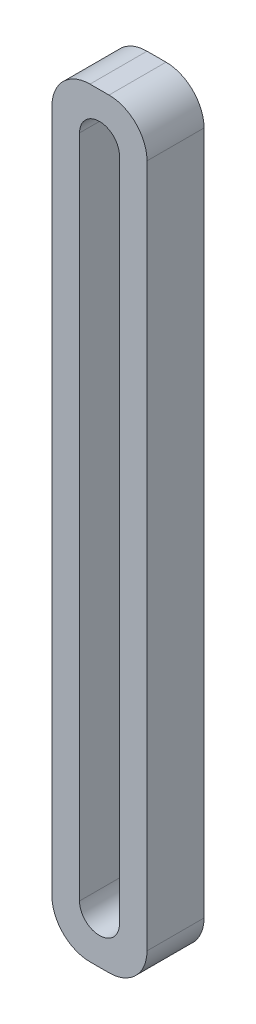
ISO-10303-21;
HEADER;
FILE_DESCRIPTION(('STEP AP214'),'2;1');
FILE_NAME('part.step','',(''),(''),'','','');
FILE_SCHEMA(('AUTOMOTIVE_DESIGN { 1 0 10303 214 1 1 1 1 }'));
ENDSEC;
DATA;
#1=APPLICATION_CONTEXT('core data for automotive mechanical design processes');
#2=APPLICATION_PROTOCOL_DEFINITION('international standard','automotive_design',2000,#1);
#3=PRODUCT_CONTEXT('',#1,'mechanical');
#4=PRODUCT('Part','Part','',(#3));
#5=PRODUCT_RELATED_PRODUCT_CATEGORY('part','',(#4));
#6=PRODUCT_DEFINITION_FORMATION('','',#4);
#7=PRODUCT_DEFINITION_CONTEXT('part definition',#1,'design');
#8=PRODUCT_DEFINITION('design','',#6,#7);
#9=PRODUCT_DEFINITION_SHAPE('','',#8);
#10=(LENGTH_UNIT() NAMED_UNIT(*) SI_UNIT(.MILLI.,.METRE.));
#11=(NAMED_UNIT(*) PLANE_ANGLE_UNIT() SI_UNIT($,.RADIAN.));
#12=(NAMED_UNIT(*) SI_UNIT($,.STERADIAN.) SOLID_ANGLE_UNIT());
#13=UNCERTAINTY_MEASURE_WITH_UNIT(LENGTH_MEASURE(1.E-05),#10,'distance_accuracy_value','');
#14=(GEOMETRIC_REPRESENTATION_CONTEXT(3) GLOBAL_UNCERTAINTY_ASSIGNED_CONTEXT((#13)) GLOBAL_UNIT_ASSIGNED_CONTEXT((#10,
#11,#12)) REPRESENTATION_CONTEXT('',''));
#15=CARTESIAN_POINT('',(0.,0.,0.));
#16=DIRECTION('',(0.,0.,1.));
#17=DIRECTION('',(1.,0.,0.));
#18=AXIS2_PLACEMENT_3D('',#15,#16,#17);
#19=CARTESIAN_POINT('',(0.,0.,3.));
#20=DIRECTION('',(0.,0.,-1.));
#21=DIRECTION('',(-1.,0.,0.));
#22=AXIS2_PLACEMENT_3D('',#19,#20,#21);
#23=PLANE('',#22);
#24=DIRECTION('',(1.,0.,0.));
#25=VECTOR('',#24,1.);
#26=CARTESIAN_POINT('',(0.,0.,3.));
#27=LINE('',#26,#25);
#28=CARTESIAN_POINT('',(2.,0.,3.));
#29=VERTEX_POINT('',#28);
#30=CARTESIAN_POINT('',(3.,0.,3.));
#31=VERTEX_POINT('',#30);
#32=EDGE_CURVE('E167',#29,#31,#27,.T.);
#33=ORIENTED_EDGE('',*,*,#32,.T.);
#34=CARTESIAN_POINT('',(3.,2.,3.));
#35=DIRECTION('',(0.,0.,-1.));
#36=DIRECTION('',(-1.,0.,0.));
#37=AXIS2_PLACEMENT_3D('',#34,#35,#36);
#38=CIRCLE('',#37,2.);
#39=CARTESIAN_POINT('',(5.,2.,3.));
#40=VERTEX_POINT('',#39);
#41=EDGE_CURVE('E207',#31,#40,#38,.F.);
#42=ORIENTED_EDGE('',*,*,#41,.T.);
#43=DIRECTION('',(0.,1.,0.));
#44=VECTOR('',#43,1.);
#45=CARTESIAN_POINT('',(5.,0.,3.));
#46=LINE('',#45,#44);
#47=CARTESIAN_POINT('',(5.,38.,3.));
#48=VERTEX_POINT('',#47);
#49=EDGE_CURVE('E171',#40,#48,#46,.T.);
#50=ORIENTED_EDGE('',*,*,#49,.T.);
#51=CARTESIAN_POINT('',(3.,38.,3.));
#52=DIRECTION('',(0.,0.,-1.));
#53=DIRECTION('',(-1.,0.,0.));
#54=AXIS2_PLACEMENT_3D('',#51,#52,#53);
#55=CIRCLE('',#54,2.);
#56=CARTESIAN_POINT('',(3.,40.,3.));
#57=VERTEX_POINT('',#56);
#58=EDGE_CURVE('E53',#48,#57,#55,.F.);
#59=ORIENTED_EDGE('',*,*,#58,.T.);
#60=DIRECTION('',(-1.,0.,0.));
#61=VECTOR('',#60,1.);
#62=CARTESIAN_POINT('',(0.,40.,3.));
#63=LINE('',#62,#61);
#64=CARTESIAN_POINT('',(2.,40.,3.));
#65=VERTEX_POINT('',#64);
#66=EDGE_CURVE('E173',#57,#65,#63,.T.);
#67=ORIENTED_EDGE('',*,*,#66,.T.);
#68=CARTESIAN_POINT('',(2.,38.,3.));
#69=DIRECTION('',(0.,0.,-1.));
#70=DIRECTION('',(-1.,0.,0.));
#71=AXIS2_PLACEMENT_3D('',#68,#69,#70);
#72=CIRCLE('',#71,2.);
#73=CARTESIAN_POINT('',(0.,38.,3.));
#74=VERTEX_POINT('',#73);
#75=EDGE_CURVE('E203',#65,#74,#72,.F.);
#76=ORIENTED_EDGE('',*,*,#75,.T.);
#77=DIRECTION('',(0.,-1.,0.));
#78=VECTOR('',#77,1.);
#79=CARTESIAN_POINT('',(0.,0.,3.));
#80=LINE('',#79,#78);
#81=CARTESIAN_POINT('',(0.,2.,3.));
#82=VERTEX_POINT('',#81);
#83=EDGE_CURVE('E164',#74,#82,#80,.T.);
#84=ORIENTED_EDGE('',*,*,#83,.T.);
#85=CARTESIAN_POINT('',(2.,2.,3.));
#86=DIRECTION('',(0.,0.,-1.));
#87=DIRECTION('',(-1.,0.,0.));
#88=AXIS2_PLACEMENT_3D('',#85,#86,#87);
#89=CIRCLE('',#88,2.);
#90=EDGE_CURVE('E205',#82,#29,#89,.F.);
#91=ORIENTED_EDGE('',*,*,#90,.T.);
#92=EDGE_LOOP('',(#33,#42,#50,#59,#67,#76,#84,#91));
#93=FACE_BOUND('',#92,.T.);
#94=CARTESIAN_POINT('',(2.5,37.5,3.));
#95=DIRECTION('',(0.,0.,1.));
#96=DIRECTION('',(1.,0.,0.));
#97=AXIS2_PLACEMENT_3D('',#94,#95,#96);
#98=CIRCLE('',#97,1.05);
#99=CARTESIAN_POINT('',(3.55,37.5,3.));
#100=VERTEX_POINT('',#99);
#101=CARTESIAN_POINT('',(1.45,37.5,3.));
#102=VERTEX_POINT('',#101);
#103=EDGE_CURVE('E123',#100,#102,#98,.T.);
#104=ORIENTED_EDGE('',*,*,#103,.F.);
#105=DIRECTION('',(0.,1.,0.));
#106=VECTOR('',#105,1.);
#107=CARTESIAN_POINT('',(3.55,37.5,3.));
#108=LINE('',#107,#106);
#109=CARTESIAN_POINT('',(3.55,2.5,3.));
#110=VERTEX_POINT('',#109);
#111=EDGE_CURVE('E148',#110,#100,#108,.T.);
#112=ORIENTED_EDGE('',*,*,#111,.F.);
#113=CARTESIAN_POINT('',(2.5,2.5,3.));
#114=DIRECTION('',(0.,0.,1.));
#115=DIRECTION('',(1.,0.,0.));
#116=AXIS2_PLACEMENT_3D('',#113,#114,#115);
#117=CIRCLE('',#116,1.05);
#118=CARTESIAN_POINT('',(1.45,2.5,3.));
#119=VERTEX_POINT('',#118);
#120=EDGE_CURVE('E146',#119,#110,#117,.T.);
#121=ORIENTED_EDGE('',*,*,#120,.F.);
#122=DIRECTION('',(0.,-1.,0.));
#123=VECTOR('',#122,1.);
#124=CARTESIAN_POINT('',(1.45,37.5,3.));
#125=LINE('',#124,#123);
#126=EDGE_CURVE('E133',#102,#119,#125,.T.);
#127=ORIENTED_EDGE('',*,*,#126,.F.);
#128=EDGE_LOOP('',(#104,#112,#121,#127));
#129=FACE_BOUND('',#128,.T.);
#130=ADVANCED_FACE('F33',(#93,#129),#23,.F.);
#131=CARTESIAN_POINT('',(0.,0.,0.));
#132=DIRECTION('',(0.,0.,-1.));
#133=DIRECTION('',(-1.,0.,0.));
#134=AXIS2_PLACEMENT_3D('',#131,#132,#133);
#135=PLANE('',#134);
#136=DIRECTION('',(0.,1.,0.));
#137=VECTOR('',#136,1.);
#138=CARTESIAN_POINT('',(5.,0.,0.));
#139=LINE('',#138,#137);
#140=CARTESIAN_POINT('',(5.,2.,0.));
#141=VERTEX_POINT('',#140);
#142=CARTESIAN_POINT('',(5.,38.,0.));
#143=VERTEX_POINT('',#142);
#144=EDGE_CURVE('E181',#141,#143,#139,.T.);
#145=ORIENTED_EDGE('',*,*,#144,.F.);
#146=CARTESIAN_POINT('',(3.,2.,0.));
#147=DIRECTION('',(0.,0.,-1.));
#148=DIRECTION('',(-1.,0.,0.));
#149=AXIS2_PLACEMENT_3D('',#146,#147,#148);
#150=CIRCLE('',#149,2.);
#151=CARTESIAN_POINT('',(3.,0.,0.));
#152=VERTEX_POINT('',#151);
#153=EDGE_CURVE('E195',#141,#152,#150,.T.);
#154=ORIENTED_EDGE('',*,*,#153,.T.);
#155=DIRECTION('',(1.,0.,0.));
#156=VECTOR('',#155,1.);
#157=CARTESIAN_POINT('',(0.,0.,0.));
#158=LINE('',#157,#156);
#159=CARTESIAN_POINT('',(2.,0.,0.));
#160=VERTEX_POINT('',#159);
#161=EDGE_CURVE('E178',#160,#152,#158,.T.);
#162=ORIENTED_EDGE('',*,*,#161,.F.);
#163=CARTESIAN_POINT('',(2.,2.,0.));
#164=DIRECTION('',(0.,0.,-1.));
#165=DIRECTION('',(-1.,0.,0.));
#166=AXIS2_PLACEMENT_3D('',#163,#164,#165);
#167=CIRCLE('',#166,2.);
#168=CARTESIAN_POINT('',(0.,2.,0.));
#169=VERTEX_POINT('',#168);
#170=EDGE_CURVE('E193',#160,#169,#167,.T.);
#171=ORIENTED_EDGE('',*,*,#170,.T.);
#172=DIRECTION('',(0.,-1.,0.));
#173=VECTOR('',#172,1.);
#174=CARTESIAN_POINT('',(0.,0.,0.));
#175=LINE('',#174,#173);
#176=CARTESIAN_POINT('',(0.,38.,0.));
#177=VERTEX_POINT('',#176);
#178=EDGE_CURVE('E141',#177,#169,#175,.T.);
#179=ORIENTED_EDGE('',*,*,#178,.F.);
#180=CARTESIAN_POINT('',(2.,38.,0.));
#181=DIRECTION('',(0.,0.,-1.));
#182=DIRECTION('',(-1.,0.,0.));
#183=AXIS2_PLACEMENT_3D('',#180,#181,#182);
#184=CIRCLE('',#183,2.);
#185=CARTESIAN_POINT('',(2.,40.,0.));
#186=VERTEX_POINT('',#185);
#187=EDGE_CURVE('E191',#177,#186,#184,.T.);
#188=ORIENTED_EDGE('',*,*,#187,.T.);
#189=DIRECTION('',(-1.,0.,0.));
#190=VECTOR('',#189,1.);
#191=CARTESIAN_POINT('',(0.,40.,0.));
#192=LINE('',#191,#190);
#193=CARTESIAN_POINT('',(3.,40.,0.));
#194=VERTEX_POINT('',#193);
#195=EDGE_CURVE('E168',#194,#186,#192,.T.);
#196=ORIENTED_EDGE('',*,*,#195,.F.);
#197=CARTESIAN_POINT('',(3.,38.,0.));
#198=DIRECTION('',(0.,0.,-1.));
#199=DIRECTION('',(-1.,0.,0.));
#200=AXIS2_PLACEMENT_3D('',#197,#198,#199);
#201=CIRCLE('',#200,2.);
#202=EDGE_CURVE('E189',#194,#143,#201,.T.);
#203=ORIENTED_EDGE('',*,*,#202,.T.);
#204=EDGE_LOOP('',(#145,#154,#162,#171,#179,#188,#196,#203));
#205=FACE_BOUND('',#204,.T.);
#206=DIRECTION('',(0.,1.,0.));
#207=VECTOR('',#206,1.);
#208=CARTESIAN_POINT('',(3.55,37.5,0.));
#209=LINE('',#208,#207);
#210=CARTESIAN_POINT('',(3.55,2.5,0.));
#211=VERTEX_POINT('',#210);
#212=CARTESIAN_POINT('',(3.55,37.5,0.));
#213=VERTEX_POINT('',#212);
#214=EDGE_CURVE('E134',#211,#213,#209,.T.);
#215=ORIENTED_EDGE('',*,*,#214,.T.);
#216=CARTESIAN_POINT('',(2.5,37.5,0.));
#217=DIRECTION('',(0.,0.,1.));
#218=DIRECTION('',(1.,0.,0.));
#219=AXIS2_PLACEMENT_3D('',#216,#217,#218);
#220=CIRCLE('',#219,1.05);
#221=CARTESIAN_POINT('',(1.45,37.5,0.));
#222=VERTEX_POINT('',#221);
#223=EDGE_CURVE('E152',#213,#222,#220,.T.);
#224=ORIENTED_EDGE('',*,*,#223,.T.);
#225=DIRECTION('',(0.,-1.,0.));
#226=VECTOR('',#225,1.);
#227=CARTESIAN_POINT('',(1.45,37.5,0.));
#228=LINE('',#227,#226);
#229=CARTESIAN_POINT('',(1.45,2.5,0.));
#230=VERTEX_POINT('',#229);
#231=EDGE_CURVE('E140',#222,#230,#228,.T.);
#232=ORIENTED_EDGE('',*,*,#231,.T.);
#233=CARTESIAN_POINT('',(2.5,2.5,0.));
#234=DIRECTION('',(0.,0.,1.));
#235=DIRECTION('',(1.,0.,0.));
#236=AXIS2_PLACEMENT_3D('',#233,#234,#235);
#237=CIRCLE('',#236,1.05);
#238=EDGE_CURVE('E155',#230,#211,#237,.T.);
#239=ORIENTED_EDGE('',*,*,#238,.T.);
#240=EDGE_LOOP('',(#215,#224,#232,#239));
#241=FACE_BOUND('',#240,.T.);
#242=ADVANCED_FACE('F220',(#205,#241),#135,.T.);
#243=CARTESIAN_POINT('',(0.,0.,3.));
#244=DIRECTION('',(1.,0.,0.));
#245=DIRECTION('',(0.,0.,-1.));
#246=AXIS2_PLACEMENT_3D('',#243,#244,#245);
#247=PLANE('',#246);
#248=ORIENTED_EDGE('',*,*,#178,.T.);
#249=DIRECTION('',(0.,0.,-1.));
#250=VECTOR('',#249,1.);
#251=CARTESIAN_POINT('',(0.,2.,3.));
#252=LINE('',#251,#250);
#253=EDGE_CURVE('E212',#169,#82,#252,.F.);
#254=ORIENTED_EDGE('',*,*,#253,.T.);
#255=ORIENTED_EDGE('',*,*,#83,.F.);
#256=DIRECTION('',(0.,0.,-1.));
#257=VECTOR('',#256,1.);
#258=CARTESIAN_POINT('',(0.,38.,3.));
#259=LINE('',#258,#257);
#260=EDGE_CURVE('E209',#74,#177,#259,.T.);
#261=ORIENTED_EDGE('',*,*,#260,.T.);
#262=EDGE_LOOP('',(#248,#254,#255,#261));
#263=FACE_BOUND('',#262,.T.);
#264=ADVANCED_FACE('F229',(#263),#247,.F.);
#265=CARTESIAN_POINT('',(0.,0.,3.));
#266=DIRECTION('',(0.,1.,0.));
#267=DIRECTION('',(0.,0.,1.));
#268=AXIS2_PLACEMENT_3D('',#265,#266,#267);
#269=PLANE('',#268);
#270=ORIENTED_EDGE('',*,*,#161,.T.);
#271=DIRECTION('',(0.,0.,-1.));
#272=VECTOR('',#271,1.);
#273=CARTESIAN_POINT('',(3.,0.,3.));
#274=LINE('',#273,#272);
#275=EDGE_CURVE('E200',#152,#31,#274,.F.);
#276=ORIENTED_EDGE('',*,*,#275,.T.);
#277=ORIENTED_EDGE('',*,*,#32,.F.);
#278=DIRECTION('',(0.,0.,-1.));
#279=VECTOR('',#278,1.);
#280=CARTESIAN_POINT('',(2.,0.,3.));
#281=LINE('',#280,#279);
#282=EDGE_CURVE('E197',#29,#160,#281,.T.);
#283=ORIENTED_EDGE('',*,*,#282,.T.);
#284=EDGE_LOOP('',(#270,#276,#277,#283));
#285=FACE_BOUND('',#284,.T.);
#286=ADVANCED_FACE('F238',(#285),#269,.F.);
#287=CARTESIAN_POINT('',(5.,0.,3.));
#288=DIRECTION('',(-1.,0.,0.));
#289=DIRECTION('',(0.,0.,1.));
#290=AXIS2_PLACEMENT_3D('',#287,#288,#289);
#291=PLANE('',#290);
#292=ORIENTED_EDGE('',*,*,#49,.F.);
#293=DIRECTION('',(0.,0.,-1.));
#294=VECTOR('',#293,1.);
#295=CARTESIAN_POINT('',(5.,2.,3.));
#296=LINE('',#295,#294);
#297=EDGE_CURVE('E186',#40,#141,#296,.T.);
#298=ORIENTED_EDGE('',*,*,#297,.T.);
#299=ORIENTED_EDGE('',*,*,#144,.T.);
#300=DIRECTION('',(0.,0.,-1.));
#301=VECTOR('',#300,1.);
#302=CARTESIAN_POINT('',(5.,38.,3.));
#303=LINE('',#302,#301);
#304=EDGE_CURVE('E175',#143,#48,#303,.F.);
#305=ORIENTED_EDGE('',*,*,#304,.T.);
#306=EDGE_LOOP('',(#292,#298,#299,#305));
#307=FACE_BOUND('',#306,.T.);
#308=ADVANCED_FACE('F246',(#307),#291,.F.);
#309=CARTESIAN_POINT('',(0.,40.,3.));
#310=DIRECTION('',(0.,-1.,0.));
#311=DIRECTION('',(1.,0.,0.));
#312=AXIS2_PLACEMENT_3D('',#309,#310,#311);
#313=PLANE('',#312);
#314=ORIENTED_EDGE('',*,*,#195,.T.);
#315=DIRECTION('',(0.,0.,-1.));
#316=VECTOR('',#315,1.);
#317=CARTESIAN_POINT('',(2.,40.,3.));
#318=LINE('',#317,#316);
#319=EDGE_CURVE('E11',#186,#65,#318,.F.);
#320=ORIENTED_EDGE('',*,*,#319,.T.);
#321=ORIENTED_EDGE('',*,*,#66,.F.);
#322=DIRECTION('',(0.,0.,-1.));
#323=VECTOR('',#322,1.);
#324=CARTESIAN_POINT('',(3.,40.,3.));
#325=LINE('',#324,#323);
#326=EDGE_CURVE('E41',#57,#194,#325,.T.);
#327=ORIENTED_EDGE('',*,*,#326,.T.);
#328=EDGE_LOOP('',(#314,#320,#321,#327));
#329=FACE_BOUND('',#328,.T.);
#330=ADVANCED_FACE('F216',(#329),#313,.F.);
#331=CARTESIAN_POINT('',(2.5,37.5,3.));
#332=DIRECTION('',(0.,0.,-1.));
#333=DIRECTION('',(-1.,0.,0.));
#334=AXIS2_PLACEMENT_3D('',#331,#332,#333);
#335=CYLINDRICAL_SURFACE('',#334,1.05);
#336=ORIENTED_EDGE('',*,*,#223,.F.);
#337=DIRECTION('',(0.,0.,-1.));
#338=VECTOR('',#337,1.);
#339=CARTESIAN_POINT('',(3.55,37.5,3.));
#340=LINE('',#339,#338);
#341=EDGE_CURVE('E129',#100,#213,#340,.T.);
#342=ORIENTED_EDGE('',*,*,#341,.F.);
#343=ORIENTED_EDGE('',*,*,#103,.T.);
#344=DIRECTION('',(0.,0.,-1.));
#345=VECTOR('',#344,1.);
#346=CARTESIAN_POINT('',(1.45,37.5,3.));
#347=LINE('',#346,#345);
#348=EDGE_CURVE('E126',#102,#222,#347,.T.);
#349=ORIENTED_EDGE('',*,*,#348,.T.);
#350=EDGE_LOOP('',(#336,#342,#343,#349));
#351=FACE_BOUND('',#350,.T.);
#352=ADVANCED_FACE('F125',(#351),#335,.F.);
#353=CARTESIAN_POINT('',(1.45,37.5,3.));
#354=DIRECTION('',(1.,0.,0.));
#355=DIRECTION('',(0.,0.,-1.));
#356=AXIS2_PLACEMENT_3D('',#353,#354,#355);
#357=PLANE('',#356);
#358=ORIENTED_EDGE('',*,*,#231,.F.);
#359=ORIENTED_EDGE('',*,*,#348,.F.);
#360=ORIENTED_EDGE('',*,*,#126,.T.);
#361=DIRECTION('',(0.,0.,-1.));
#362=VECTOR('',#361,1.);
#363=CARTESIAN_POINT('',(1.45,2.5,3.));
#364=LINE('',#363,#362);
#365=EDGE_CURVE('E142',#119,#230,#364,.T.);
#366=ORIENTED_EDGE('',*,*,#365,.T.);
#367=EDGE_LOOP('',(#358,#359,#360,#366));
#368=FACE_BOUND('',#367,.T.);
#369=ADVANCED_FACE('F137',(#368),#357,.T.);
#370=CARTESIAN_POINT('',(2.5,2.5,3.));
#371=DIRECTION('',(0.,0.,-1.));
#372=DIRECTION('',(-1.,0.,0.));
#373=AXIS2_PLACEMENT_3D('',#370,#371,#372);
#374=CYLINDRICAL_SURFACE('',#373,1.05);
#375=ORIENTED_EDGE('',*,*,#238,.F.);
#376=ORIENTED_EDGE('',*,*,#365,.F.);
#377=ORIENTED_EDGE('',*,*,#120,.T.);
#378=DIRECTION('',(0.,0.,-1.));
#379=VECTOR('',#378,1.);
#380=CARTESIAN_POINT('',(3.55,2.5,3.));
#381=LINE('',#380,#379);
#382=EDGE_CURVE('E161',#110,#211,#381,.T.);
#383=ORIENTED_EDGE('',*,*,#382,.T.);
#384=EDGE_LOOP('',(#375,#376,#377,#383));
#385=FACE_BOUND('',#384,.T.);
#386=ADVANCED_FACE('F301',(#385),#374,.F.);
#387=CARTESIAN_POINT('',(3.55,37.5,3.));
#388=DIRECTION('',(-1.,0.,0.));
#389=DIRECTION('',(0.,0.,1.));
#390=AXIS2_PLACEMENT_3D('',#387,#388,#389);
#391=PLANE('',#390);
#392=ORIENTED_EDGE('',*,*,#214,.F.);
#393=ORIENTED_EDGE('',*,*,#382,.F.);
#394=ORIENTED_EDGE('',*,*,#111,.T.);
#395=ORIENTED_EDGE('',*,*,#341,.T.);
#396=EDGE_LOOP('',(#392,#393,#394,#395));
#397=FACE_BOUND('',#396,.T.);
#398=ADVANCED_FACE('F272',(#397),#391,.T.);
#399=CARTESIAN_POINT('',(3.,2.,3.));
#400=DIRECTION('',(0.,0.,-1.));
#401=DIRECTION('',(-1.,0.,0.));
#402=AXIS2_PLACEMENT_3D('',#399,#400,#401);
#403=CYLINDRICAL_SURFACE('',#402,2.);
#404=ORIENTED_EDGE('',*,*,#41,.F.);
#405=ORIENTED_EDGE('',*,*,#275,.F.);
#406=ORIENTED_EDGE('',*,*,#153,.F.);
#407=ORIENTED_EDGE('',*,*,#297,.F.);
#408=EDGE_LOOP('',(#404,#405,#406,#407));
#409=FACE_BOUND('',#408,.T.);
#410=ADVANCED_FACE('F243',(#409),#403,.T.);
#411=CARTESIAN_POINT('',(2.,2.,3.));
#412=DIRECTION('',(0.,0.,-1.));
#413=DIRECTION('',(-1.,0.,0.));
#414=AXIS2_PLACEMENT_3D('',#411,#412,#413);
#415=CYLINDRICAL_SURFACE('',#414,2.);
#416=ORIENTED_EDGE('',*,*,#90,.F.);
#417=ORIENTED_EDGE('',*,*,#253,.F.);
#418=ORIENTED_EDGE('',*,*,#170,.F.);
#419=ORIENTED_EDGE('',*,*,#282,.F.);
#420=EDGE_LOOP('',(#416,#417,#418,#419));
#421=FACE_BOUND('',#420,.T.);
#422=ADVANCED_FACE('F235',(#421),#415,.T.);
#423=CARTESIAN_POINT('',(2.,38.,3.));
#424=DIRECTION('',(0.,0.,-1.));
#425=DIRECTION('',(-1.,0.,0.));
#426=AXIS2_PLACEMENT_3D('',#423,#424,#425);
#427=CYLINDRICAL_SURFACE('',#426,2.);
#428=ORIENTED_EDGE('',*,*,#75,.F.);
#429=ORIENTED_EDGE('',*,*,#319,.F.);
#430=ORIENTED_EDGE('',*,*,#187,.F.);
#431=ORIENTED_EDGE('',*,*,#260,.F.);
#432=EDGE_LOOP('',(#428,#429,#430,#431));
#433=FACE_BOUND('',#432,.T.);
#434=ADVANCED_FACE('F226',(#433),#427,.T.);
#435=CARTESIAN_POINT('',(3.,38.,3.));
#436=DIRECTION('',(0.,0.,-1.));
#437=DIRECTION('',(-1.,0.,0.));
#438=AXIS2_PLACEMENT_3D('',#435,#436,#437);
#439=CYLINDRICAL_SURFACE('',#438,2.);
#440=ORIENTED_EDGE('',*,*,#58,.F.);
#441=ORIENTED_EDGE('',*,*,#304,.F.);
#442=ORIENTED_EDGE('',*,*,#202,.F.);
#443=ORIENTED_EDGE('',*,*,#326,.F.);
#444=EDGE_LOOP('',(#440,#441,#442,#443));
#445=FACE_BOUND('',#444,.T.);
#446=ADVANCED_FACE('F35',(#445),#439,.T.);
#447=CLOSED_SHELL('',(#130,#242,#264,#286,#308,#330,#352,#369,#386,#398,#410,#422,#434,#446));
#448=MANIFOLD_SOLID_BREP('B2',#447);
#449=ADVANCED_BREP_SHAPE_REPRESENTATION('',(#18,#448),#14);
#450=SHAPE_DEFINITION_REPRESENTATION(#9,#449);
ENDSEC;
END-ISO-10303-21;
